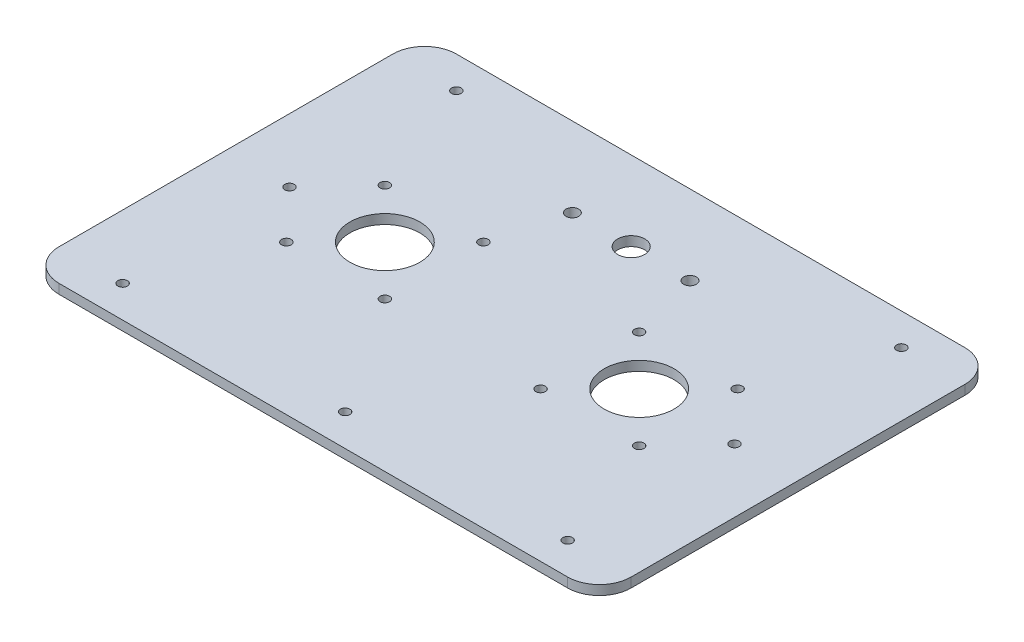
ISO-10303-21;
HEADER;
FILE_DESCRIPTION(('STEP AP214'),'2;1');
FILE_NAME('part.step','',(''),(''),'','','');
FILE_SCHEMA(('AUTOMOTIVE_DESIGN { 1 0 10303 214 1 1 1 1 }'));
ENDSEC;
DATA;
#1=APPLICATION_CONTEXT('core data for automotive mechanical design processes');
#2=APPLICATION_PROTOCOL_DEFINITION('international standard','automotive_design',2000,#1);
#3=PRODUCT_CONTEXT('',#1,'mechanical');
#4=PRODUCT('Part','Part','',(#3));
#5=PRODUCT_RELATED_PRODUCT_CATEGORY('part','',(#4));
#6=PRODUCT_DEFINITION_FORMATION('','',#4);
#7=PRODUCT_DEFINITION_CONTEXT('part definition',#1,'design');
#8=PRODUCT_DEFINITION('design','',#6,#7);
#9=PRODUCT_DEFINITION_SHAPE('','',#8);
#10=(LENGTH_UNIT() NAMED_UNIT(*) SI_UNIT(.MILLI.,.METRE.));
#11=(NAMED_UNIT(*) PLANE_ANGLE_UNIT() SI_UNIT($,.RADIAN.));
#12=(NAMED_UNIT(*) SI_UNIT($,.STERADIAN.) SOLID_ANGLE_UNIT());
#13=UNCERTAINTY_MEASURE_WITH_UNIT(LENGTH_MEASURE(1.E-05),#10,'distance_accuracy_value','');
#14=(GEOMETRIC_REPRESENTATION_CONTEXT(3) GLOBAL_UNCERTAINTY_ASSIGNED_CONTEXT((#13)) GLOBAL_UNIT_ASSIGNED_CONTEXT((#10,
#11,#12)) REPRESENTATION_CONTEXT('',''));
#15=CARTESIAN_POINT('',(0.,0.,0.));
#16=DIRECTION('',(0.,0.,1.));
#17=DIRECTION('',(1.,0.,0.));
#18=AXIS2_PLACEMENT_3D('',#15,#16,#17);
#19=CARTESIAN_POINT('',(-80.,-3.,52.5));
#20=DIRECTION('',(0.,1.,0.));
#21=DIRECTION('',(0.,0.,1.));
#22=AXIS2_PLACEMENT_3D('',#19,#20,#21);
#23=CYLINDRICAL_SURFACE('',#22,9.99999999999998);
#24=CARTESIAN_POINT('',(-80.,0.,52.5));
#25=DIRECTION('',(0.,1.,0.));
#26=DIRECTION('',(0.,0.,1.));
#27=AXIS2_PLACEMENT_3D('',#24,#25,#26);
#28=CIRCLE('',#27,9.99999999999998);
#29=CARTESIAN_POINT('',(-90.,0.,52.5));
#30=VERTEX_POINT('',#29);
#31=CARTESIAN_POINT('',(-79.9999999999999,0.,62.5));
#32=VERTEX_POINT('',#31);
#33=EDGE_CURVE('E134',#30,#32,#28,.T.);
#34=ORIENTED_EDGE('',*,*,#33,.F.);
#35=DIRECTION('',(0.,1.,0.));
#36=VECTOR('',#35,1.);
#37=CARTESIAN_POINT('',(-90.,-3.,52.5));
#38=LINE('',#37,#36);
#39=CARTESIAN_POINT('',(-90.,-3.,52.5));
#40=VERTEX_POINT('',#39);
#41=EDGE_CURVE('E11',#40,#30,#38,.T.);
#42=ORIENTED_EDGE('',*,*,#41,.F.);
#43=CARTESIAN_POINT('',(-80.,-3.,52.5));
#44=DIRECTION('',(0.,1.,0.));
#45=DIRECTION('',(0.,0.,1.));
#46=AXIS2_PLACEMENT_3D('',#43,#44,#45);
#47=CIRCLE('',#46,9.99999999999998);
#48=CARTESIAN_POINT('',(-79.9999999999999,-3.,62.5));
#49=VERTEX_POINT('',#48);
#50=EDGE_CURVE('E155',#40,#49,#47,.T.);
#51=ORIENTED_EDGE('',*,*,#50,.T.);
#52=DIRECTION('',(0.,1.,0.));
#53=VECTOR('',#52,1.);
#54=CARTESIAN_POINT('',(-79.9999999999999,-3.,62.5));
#55=LINE('',#54,#53);
#56=EDGE_CURVE('E40',#49,#32,#55,.T.);
#57=ORIENTED_EDGE('',*,*,#56,.T.);
#58=EDGE_LOOP('',(#34,#42,#51,#57));
#59=FACE_BOUND('',#58,.T.);
#60=ADVANCED_FACE('F37',(#59),#23,.T.);
#61=CARTESIAN_POINT('',(-90.,-3.,-52.5));
#62=DIRECTION('',(-1.,0.,0.));
#63=DIRECTION('',(0.,0.,1.));
#64=AXIS2_PLACEMENT_3D('',#61,#62,#63);
#65=PLANE('',#64);
#66=DIRECTION('',(0.,0.,1.));
#67=VECTOR('',#66,1.);
#68=CARTESIAN_POINT('',(-90.,0.,-52.5));
#69=LINE('',#68,#67);
#70=CARTESIAN_POINT('',(-90.,0.,-52.5));
#71=VERTEX_POINT('',#70);
#72=EDGE_CURVE('E153',#71,#30,#69,.T.);
#73=ORIENTED_EDGE('',*,*,#72,.F.);
#74=DIRECTION('',(0.,1.,0.));
#75=VECTOR('',#74,1.);
#76=CARTESIAN_POINT('',(-90.,-3.,-52.5));
#77=LINE('',#76,#75);
#78=CARTESIAN_POINT('',(-90.,-3.,-52.5));
#79=VERTEX_POINT('',#78);
#80=EDGE_CURVE('E46',#79,#71,#77,.T.);
#81=ORIENTED_EDGE('',*,*,#80,.F.);
#82=DIRECTION('',(0.,0.,1.));
#83=VECTOR('',#82,1.);
#84=CARTESIAN_POINT('',(-90.,-3.,-52.5));
#85=LINE('',#84,#83);
#86=EDGE_CURVE('E124',#79,#40,#85,.T.);
#87=ORIENTED_EDGE('',*,*,#86,.T.);
#88=ORIENTED_EDGE('',*,*,#41,.T.);
#89=EDGE_LOOP('',(#73,#81,#87,#88));
#90=FACE_BOUND('',#89,.T.);
#91=ADVANCED_FACE('F167',(#90),#65,.T.);
#92=CARTESIAN_POINT('',(-80.,-3.,-52.5));
#93=DIRECTION('',(0.,1.,0.));
#94=DIRECTION('',(0.,0.,1.));
#95=AXIS2_PLACEMENT_3D('',#92,#93,#94);
#96=CYLINDRICAL_SURFACE('',#95,10.);
#97=CARTESIAN_POINT('',(-80.,0.,-52.5));
#98=DIRECTION('',(0.,1.,0.));
#99=DIRECTION('',(0.,0.,1.));
#100=AXIS2_PLACEMENT_3D('',#97,#98,#99);
#101=CIRCLE('',#100,10.);
#102=CARTESIAN_POINT('',(-79.9999999999999,0.,-62.5));
#103=VERTEX_POINT('',#102);
#104=EDGE_CURVE('E111',#103,#71,#101,.T.);
#105=ORIENTED_EDGE('',*,*,#104,.F.);
#106=DIRECTION('',(0.,1.,0.));
#107=VECTOR('',#106,1.);
#108=CARTESIAN_POINT('',(-79.9999999999999,-3.,-62.5));
#109=LINE('',#108,#107);
#110=CARTESIAN_POINT('',(-79.9999999999999,-3.,-62.5));
#111=VERTEX_POINT('',#110);
#112=EDGE_CURVE('E106',#111,#103,#109,.T.);
#113=ORIENTED_EDGE('',*,*,#112,.F.);
#114=CARTESIAN_POINT('',(-80.,-3.,-52.5));
#115=DIRECTION('',(0.,1.,0.));
#116=DIRECTION('',(0.,0.,1.));
#117=AXIS2_PLACEMENT_3D('',#114,#115,#116);
#118=CIRCLE('',#117,10.);
#119=EDGE_CURVE('E109',#111,#79,#118,.T.);
#120=ORIENTED_EDGE('',*,*,#119,.T.);
#121=ORIENTED_EDGE('',*,*,#80,.T.);
#122=EDGE_LOOP('',(#105,#113,#120,#121));
#123=FACE_BOUND('',#122,.T.);
#124=ADVANCED_FACE('F108',(#123),#96,.T.);
#125=CARTESIAN_POINT('',(-79.9999999999999,-3.,-62.5));
#126=DIRECTION('',(0.,0.,-1.));
#127=DIRECTION('',(-1.,0.,0.));
#128=AXIS2_PLACEMENT_3D('',#125,#126,#127);
#129=PLANE('',#128);
#130=DIRECTION('',(-1.,0.,0.));
#131=VECTOR('',#130,1.);
#132=CARTESIAN_POINT('',(-79.9999999999999,0.,-62.5));
#133=LINE('',#132,#131);
#134=CARTESIAN_POINT('',(79.9999999999999,0.,-62.5));
#135=VERTEX_POINT('',#134);
#136=EDGE_CURVE('E150',#135,#103,#133,.T.);
#137=ORIENTED_EDGE('',*,*,#136,.F.);
#138=DIRECTION('',(0.,1.,0.));
#139=VECTOR('',#138,1.);
#140=CARTESIAN_POINT('',(79.9999999999999,-3.,-62.5));
#141=LINE('',#140,#139);
#142=CARTESIAN_POINT('',(79.9999999999999,-3.,-62.5));
#143=VERTEX_POINT('',#142);
#144=EDGE_CURVE('E116',#143,#135,#141,.T.);
#145=ORIENTED_EDGE('',*,*,#144,.F.);
#146=DIRECTION('',(-1.,0.,0.));
#147=VECTOR('',#146,1.);
#148=CARTESIAN_POINT('',(-79.9999999999999,-3.,-62.5));
#149=LINE('',#148,#147);
#150=EDGE_CURVE('E122',#143,#111,#149,.T.);
#151=ORIENTED_EDGE('',*,*,#150,.T.);
#152=ORIENTED_EDGE('',*,*,#112,.T.);
#153=EDGE_LOOP('',(#137,#145,#151,#152));
#154=FACE_BOUND('',#153,.T.);
#155=ADVANCED_FACE('F126',(#154),#129,.T.);
#156=CARTESIAN_POINT('',(80.,-3.,-52.5));
#157=DIRECTION('',(0.,1.,0.));
#158=DIRECTION('',(0.,0.,1.));
#159=AXIS2_PLACEMENT_3D('',#156,#157,#158);
#160=CYLINDRICAL_SURFACE('',#159,10.);
#161=CARTESIAN_POINT('',(80.,0.,-52.5));
#162=DIRECTION('',(0.,1.,0.));
#163=DIRECTION('',(0.,0.,1.));
#164=AXIS2_PLACEMENT_3D('',#161,#162,#163);
#165=CIRCLE('',#164,10.);
#166=CARTESIAN_POINT('',(90.,0.,-52.5));
#167=VERTEX_POINT('',#166);
#168=EDGE_CURVE('E147',#167,#135,#165,.T.);
#169=ORIENTED_EDGE('',*,*,#168,.F.);
#170=DIRECTION('',(0.,1.,0.));
#171=VECTOR('',#170,1.);
#172=CARTESIAN_POINT('',(90.,-3.,-52.5));
#173=LINE('',#172,#171);
#174=CARTESIAN_POINT('',(90.,-3.,-52.5));
#175=VERTEX_POINT('',#174);
#176=EDGE_CURVE('E159',#175,#167,#173,.T.);
#177=ORIENTED_EDGE('',*,*,#176,.F.);
#178=CARTESIAN_POINT('',(80.,-3.,-52.5));
#179=DIRECTION('',(0.,1.,0.));
#180=DIRECTION('',(0.,0.,1.));
#181=AXIS2_PLACEMENT_3D('',#178,#179,#180);
#182=CIRCLE('',#181,10.);
#183=EDGE_CURVE('E127',#175,#143,#182,.T.);
#184=ORIENTED_EDGE('',*,*,#183,.T.);
#185=ORIENTED_EDGE('',*,*,#144,.T.);
#186=EDGE_LOOP('',(#169,#177,#184,#185));
#187=FACE_BOUND('',#186,.T.);
#188=ADVANCED_FACE('F180',(#187),#160,.T.);
#189=CARTESIAN_POINT('',(90.,-3.,-52.5));
#190=DIRECTION('',(1.,0.,0.));
#191=DIRECTION('',(0.,0.,-1.));
#192=AXIS2_PLACEMENT_3D('',#189,#190,#191);
#193=PLANE('',#192);
#194=DIRECTION('',(0.,0.,-1.));
#195=VECTOR('',#194,1.);
#196=CARTESIAN_POINT('',(90.,0.,-52.5));
#197=LINE('',#196,#195);
#198=CARTESIAN_POINT('',(90.,0.,52.5));
#199=VERTEX_POINT('',#198);
#200=EDGE_CURVE('E144',#199,#167,#197,.T.);
#201=ORIENTED_EDGE('',*,*,#200,.F.);
#202=DIRECTION('',(0.,1.,0.));
#203=VECTOR('',#202,1.);
#204=CARTESIAN_POINT('',(90.,-3.,52.5));
#205=LINE('',#204,#203);
#206=CARTESIAN_POINT('',(90.,-3.,52.5));
#207=VERTEX_POINT('',#206);
#208=EDGE_CURVE('E161',#207,#199,#205,.T.);
#209=ORIENTED_EDGE('',*,*,#208,.F.);
#210=DIRECTION('',(0.,0.,-1.));
#211=VECTOR('',#210,1.);
#212=CARTESIAN_POINT('',(90.,-3.,-52.5));
#213=LINE('',#212,#211);
#214=EDGE_CURVE('E129',#207,#175,#213,.T.);
#215=ORIENTED_EDGE('',*,*,#214,.T.);
#216=ORIENTED_EDGE('',*,*,#176,.T.);
#217=EDGE_LOOP('',(#201,#209,#215,#216));
#218=FACE_BOUND('',#217,.T.);
#219=ADVANCED_FACE('F183',(#218),#193,.T.);
#220=CARTESIAN_POINT('',(80.,-3.,52.5));
#221=DIRECTION('',(0.,1.,0.));
#222=DIRECTION('',(0.,0.,1.));
#223=AXIS2_PLACEMENT_3D('',#220,#221,#222);
#224=CYLINDRICAL_SURFACE('',#223,9.99999999999999);
#225=CARTESIAN_POINT('',(80.,0.,52.5));
#226=DIRECTION('',(0.,1.,0.));
#227=DIRECTION('',(0.,0.,1.));
#228=AXIS2_PLACEMENT_3D('',#225,#226,#227);
#229=CIRCLE('',#228,9.99999999999999);
#230=CARTESIAN_POINT('',(79.9999999999999,0.,62.5));
#231=VERTEX_POINT('',#230);
#232=EDGE_CURVE('E141',#231,#199,#229,.T.);
#233=ORIENTED_EDGE('',*,*,#232,.F.);
#234=DIRECTION('',(0.,1.,0.));
#235=VECTOR('',#234,1.);
#236=CARTESIAN_POINT('',(79.9999999999999,-3.,62.5));
#237=LINE('',#236,#235);
#238=CARTESIAN_POINT('',(79.9999999999999,-3.,62.5));
#239=VERTEX_POINT('',#238);
#240=EDGE_CURVE('E162',#239,#231,#237,.T.);
#241=ORIENTED_EDGE('',*,*,#240,.F.);
#242=CARTESIAN_POINT('',(80.,-3.,52.5));
#243=DIRECTION('',(0.,1.,0.));
#244=DIRECTION('',(0.,0.,1.));
#245=AXIS2_PLACEMENT_3D('',#242,#243,#244);
#246=CIRCLE('',#245,9.99999999999999);
#247=EDGE_CURVE('E409',#239,#207,#246,.T.);
#248=ORIENTED_EDGE('',*,*,#247,.T.);
#249=ORIENTED_EDGE('',*,*,#208,.T.);
#250=EDGE_LOOP('',(#233,#241,#248,#249));
#251=FACE_BOUND('',#250,.T.);
#252=ADVANCED_FACE('F187',(#251),#224,.T.);
#253=CARTESIAN_POINT('',(-79.9999999999999,-3.,62.5));
#254=DIRECTION('',(0.,0.,1.));
#255=DIRECTION('',(1.,0.,0.));
#256=AXIS2_PLACEMENT_3D('',#253,#254,#255);
#257=PLANE('',#256);
#258=DIRECTION('',(1.,0.,0.));
#259=VECTOR('',#258,1.);
#260=CARTESIAN_POINT('',(-79.9999999999999,0.,62.5));
#261=LINE('',#260,#259);
#262=EDGE_CURVE('E137',#32,#231,#261,.T.);
#263=ORIENTED_EDGE('',*,*,#262,.F.);
#264=ORIENTED_EDGE('',*,*,#56,.F.);
#265=DIRECTION('',(1.,0.,0.));
#266=VECTOR('',#265,1.);
#267=CARTESIAN_POINT('',(-79.9999999999999,-3.,62.5));
#268=LINE('',#267,#266);
#269=EDGE_CURVE('E407',#49,#239,#268,.T.);
#270=ORIENTED_EDGE('',*,*,#269,.T.);
#271=ORIENTED_EDGE('',*,*,#240,.T.);
#272=EDGE_LOOP('',(#263,#264,#270,#271));
#273=FACE_BOUND('',#272,.T.);
#274=ADVANCED_FACE('F164',(#273),#257,.T.);
#275=CARTESIAN_POINT('',(-80.,-3.,52.5));
#276=DIRECTION('',(0.,1.,0.));
#277=DIRECTION('',(0.,0.,1.));
#278=AXIS2_PLACEMENT_3D('',#275,#276,#277);
#279=PLANE('',#278);
#280=CARTESIAN_POINT('',(-55.4999999999996,-3.,-15.4999999999976));
#281=DIRECTION('',(0.,1.,0.));
#282=DIRECTION('',(0.,0.,1.));
#283=AXIS2_PLACEMENT_3D('',#280,#281,#282);
#284=CIRCLE('',#283,1.5);
#285=CARTESIAN_POINT('',(-55.4999999999996,-3.,-13.9999999999976));
#286=VERTEX_POINT('',#285);
#287=EDGE_CURVE('E286',#286,#286,#284,.T.);
#288=ORIENTED_EDGE('',*,*,#287,.T.);
#289=EDGE_LOOP('',(#288));
#290=FACE_BOUND('',#289,.T.);
#291=CARTESIAN_POINT('',(-55.4999999999975,-3.,15.5000000000022));
#292=DIRECTION('',(0.,1.,0.));
#293=DIRECTION('',(0.,0.,1.));
#294=AXIS2_PLACEMENT_3D('',#291,#292,#293);
#295=CIRCLE('',#294,1.50000000000001);
#296=CARTESIAN_POINT('',(-55.4999999999975,-3.,17.0000000000022));
#297=VERTEX_POINT('',#296);
#298=EDGE_CURVE('E294',#297,#297,#295,.T.);
#299=ORIENTED_EDGE('',*,*,#298,.T.);
#300=EDGE_LOOP('',(#299));
#301=FACE_BOUND('',#300,.T.);
#302=CARTESIAN_POINT('',(-24.4999999999977,-3.,15.5000000000001));
#303=DIRECTION('',(0.,1.,0.));
#304=DIRECTION('',(0.,0.,1.));
#305=AXIS2_PLACEMENT_3D('',#302,#303,#304);
#306=CIRCLE('',#305,1.5);
#307=CARTESIAN_POINT('',(-24.4999999999977,-3.,17.0000000000001));
#308=VERTEX_POINT('',#307);
#309=EDGE_CURVE('E300',#308,#308,#306,.T.);
#310=ORIENTED_EDGE('',*,*,#309,.T.);
#311=EDGE_LOOP('',(#310));
#312=FACE_BOUND('',#311,.T.);
#313=CARTESIAN_POINT('',(24.5000000000002,-3.,-15.4999999999997));
#314=DIRECTION('',(0.,1.,0.));
#315=DIRECTION('',(0.,0.,1.));
#316=AXIS2_PLACEMENT_3D('',#313,#314,#315);
#317=CIRCLE('',#316,1.50000000000001);
#318=CARTESIAN_POINT('',(24.5000000000002,-3.,-13.9999999999997));
#319=VERTEX_POINT('',#318);
#320=EDGE_CURVE('E306',#319,#319,#317,.T.);
#321=ORIENTED_EDGE('',*,*,#320,.T.);
#322=EDGE_LOOP('',(#321));
#323=FACE_BOUND('',#322,.T.);
#324=CARTESIAN_POINT('',(24.5000000000003,-3.,15.5000000000003));
#325=DIRECTION('',(0.,1.,0.));
#326=DIRECTION('',(0.,0.,1.));
#327=AXIS2_PLACEMENT_3D('',#324,#325,#326);
#328=CIRCLE('',#327,1.5);
#329=CARTESIAN_POINT('',(24.5000000000003,-3.,17.0000000000003));
#330=VERTEX_POINT('',#329);
#331=EDGE_CURVE('E312',#330,#330,#328,.T.);
#332=ORIENTED_EDGE('',*,*,#331,.T.);
#333=EDGE_LOOP('',(#332));
#334=FACE_BOUND('',#333,.T.);
#335=CARTESIAN_POINT('',(55.5000000000004,-3.,15.5000000000001));
#336=DIRECTION('',(0.,1.,0.));
#337=DIRECTION('',(0.,0.,1.));
#338=AXIS2_PLACEMENT_3D('',#335,#336,#337);
#339=CIRCLE('',#338,1.5);
#340=CARTESIAN_POINT('',(55.5000000000004,-3.,17.0000000000001));
#341=VERTEX_POINT('',#340);
#342=EDGE_CURVE('E318',#341,#341,#339,.T.);
#343=ORIENTED_EDGE('',*,*,#342,.T.);
#344=EDGE_LOOP('',(#343));
#345=FACE_BOUND('',#344,.T.);
#346=CARTESIAN_POINT('',(-24.5,-3.,-15.4999999999997));
#347=DIRECTION('',(0.,1.,0.));
#348=DIRECTION('',(0.,0.,1.));
#349=AXIS2_PLACEMENT_3D('',#346,#347,#348);
#350=CIRCLE('',#349,1.5);
#351=CARTESIAN_POINT('',(-24.5,-3.,-13.9999999999997));
#352=VERTEX_POINT('',#351);
#353=EDGE_CURVE('E324',#352,#352,#350,.T.);
#354=ORIENTED_EDGE('',*,*,#353,.T.);
#355=EDGE_LOOP('',(#354));
#356=FACE_BOUND('',#355,.T.);
#357=CARTESIAN_POINT('',(55.5,-3.,-15.5));
#358=DIRECTION('',(0.,1.,0.));
#359=DIRECTION('',(0.,0.,1.));
#360=AXIS2_PLACEMENT_3D('',#357,#358,#359);
#361=CIRCLE('',#360,1.5);
#362=CARTESIAN_POINT('',(55.5,-3.,-14.));
#363=VERTEX_POINT('',#362);
#364=EDGE_CURVE('E330',#363,#363,#361,.T.);
#365=ORIENTED_EDGE('',*,*,#364,.T.);
#366=EDGE_LOOP('',(#365));
#367=FACE_BOUND('',#366,.T.);
#368=CARTESIAN_POINT('',(-40.,-3.,0.));
#369=DIRECTION('',(0.,1.,0.));
#370=DIRECTION('',(0.,0.,1.));
#371=AXIS2_PLACEMENT_3D('',#368,#369,#370);
#372=CIRCLE('',#371,11.);
#373=CARTESIAN_POINT('',(-40.,-3.,11.));
#374=VERTEX_POINT('',#373);
#375=EDGE_CURVE('E336',#374,#374,#372,.T.);
#376=ORIENTED_EDGE('',*,*,#375,.T.);
#377=EDGE_LOOP('',(#376));
#378=FACE_BOUND('',#377,.T.);
#379=CARTESIAN_POINT('',(40.,-3.,0.));
#380=DIRECTION('',(0.,1.,0.));
#381=DIRECTION('',(0.,0.,1.));
#382=AXIS2_PLACEMENT_3D('',#379,#380,#381);
#383=CIRCLE('',#382,11.);
#384=CARTESIAN_POINT('',(40.,-3.,11.));
#385=VERTEX_POINT('',#384);
#386=EDGE_CURVE('E342',#385,#385,#383,.T.);
#387=ORIENTED_EDGE('',*,*,#386,.T.);
#388=EDGE_LOOP('',(#387));
#389=FACE_BOUND('',#388,.T.);
#390=CARTESIAN_POINT('',(18.5,-3.,-37.5));
#391=DIRECTION('',(0.,1.,0.));
#392=DIRECTION('',(0.,0.,1.));
#393=AXIS2_PLACEMENT_3D('',#390,#391,#392);
#394=CIRCLE('',#393,2.);
#395=CARTESIAN_POINT('',(18.5,-3.,-35.5));
#396=VERTEX_POINT('',#395);
#397=EDGE_CURVE('E348',#396,#396,#394,.T.);
#398=ORIENTED_EDGE('',*,*,#397,.T.);
#399=EDGE_LOOP('',(#398));
#400=FACE_BOUND('',#399,.T.);
#401=CARTESIAN_POINT('',(-18.5,-3.,-37.5));
#402=DIRECTION('',(0.,1.,0.));
#403=DIRECTION('',(0.,0.,1.));
#404=AXIS2_PLACEMENT_3D('',#401,#402,#403);
#405=CIRCLE('',#404,2.);
#406=CARTESIAN_POINT('',(-18.5,-3.,-35.5));
#407=VERTEX_POINT('',#406);
#408=EDGE_CURVE('E354',#407,#407,#405,.T.);
#409=ORIENTED_EDGE('',*,*,#408,.T.);
#410=EDGE_LOOP('',(#409));
#411=FACE_BOUND('',#410,.T.);
#412=CARTESIAN_POINT('',(0.,-3.,-37.5));
#413=DIRECTION('',(0.,1.,0.));
#414=DIRECTION('',(0.,0.,1.));
#415=AXIS2_PLACEMENT_3D('',#412,#413,#414);
#416=CIRCLE('',#415,4.25);
#417=CARTESIAN_POINT('',(0.,-3.,-33.25));
#418=VERTEX_POINT('',#417);
#419=EDGE_CURVE('E360',#418,#418,#416,.T.);
#420=ORIENTED_EDGE('',*,*,#419,.T.);
#421=EDGE_LOOP('',(#420));
#422=FACE_BOUND('',#421,.T.);
#423=CARTESIAN_POINT('',(70.,-3.,-52.5));
#424=DIRECTION('',(0.,1.,0.));
#425=DIRECTION('',(0.,0.,1.));
#426=AXIS2_PLACEMENT_3D('',#423,#424,#425);
#427=CIRCLE('',#426,1.5);
#428=CARTESIAN_POINT('',(70.,-3.,-51.));
#429=VERTEX_POINT('',#428);
#430=EDGE_CURVE('E366',#429,#429,#427,.T.);
#431=ORIENTED_EDGE('',*,*,#430,.T.);
#432=EDGE_LOOP('',(#431));
#433=FACE_BOUND('',#432,.T.);
#434=CARTESIAN_POINT('',(70.,-3.,0.));
#435=DIRECTION('',(0.,1.,0.));
#436=DIRECTION('',(0.,0.,1.));
#437=AXIS2_PLACEMENT_3D('',#434,#435,#436);
#438=CIRCLE('',#437,1.5);
#439=CARTESIAN_POINT('',(70.,-3.,1.5));
#440=VERTEX_POINT('',#439);
#441=EDGE_CURVE('E372',#440,#440,#438,.T.);
#442=ORIENTED_EDGE('',*,*,#441,.T.);
#443=EDGE_LOOP('',(#442));
#444=FACE_BOUND('',#443,.T.);
#445=CARTESIAN_POINT('',(70.,-3.,52.5));
#446=DIRECTION('',(0.,1.,0.));
#447=DIRECTION('',(0.,0.,1.));
#448=AXIS2_PLACEMENT_3D('',#445,#446,#447);
#449=CIRCLE('',#448,1.5);
#450=CARTESIAN_POINT('',(70.,-3.,54.));
#451=VERTEX_POINT('',#450);
#452=EDGE_CURVE('E378',#451,#451,#449,.T.);
#453=ORIENTED_EDGE('',*,*,#452,.T.);
#454=EDGE_LOOP('',(#453));
#455=FACE_BOUND('',#454,.T.);
#456=CARTESIAN_POINT('',(0.,-3.,52.5));
#457=DIRECTION('',(0.,1.,0.));
#458=DIRECTION('',(0.,0.,1.));
#459=AXIS2_PLACEMENT_3D('',#456,#457,#458);
#460=CIRCLE('',#459,1.5);
#461=CARTESIAN_POINT('',(0.,-3.,54.));
#462=VERTEX_POINT('',#461);
#463=EDGE_CURVE('E384',#462,#462,#460,.T.);
#464=ORIENTED_EDGE('',*,*,#463,.T.);
#465=EDGE_LOOP('',(#464));
#466=FACE_BOUND('',#465,.T.);
#467=CARTESIAN_POINT('',(-70.,-3.,52.5));
#468=DIRECTION('',(0.,1.,0.));
#469=DIRECTION('',(0.,0.,1.));
#470=AXIS2_PLACEMENT_3D('',#467,#468,#469);
#471=CIRCLE('',#470,1.5);
#472=CARTESIAN_POINT('',(-70.,-3.,54.));
#473=VERTEX_POINT('',#472);
#474=EDGE_CURVE('E390',#473,#473,#471,.T.);
#475=ORIENTED_EDGE('',*,*,#474,.T.);
#476=EDGE_LOOP('',(#475));
#477=FACE_BOUND('',#476,.T.);
#478=CARTESIAN_POINT('',(-70.,-3.,0.));
#479=DIRECTION('',(0.,1.,0.));
#480=DIRECTION('',(0.,0.,1.));
#481=AXIS2_PLACEMENT_3D('',#478,#479,#480);
#482=CIRCLE('',#481,1.5);
#483=CARTESIAN_POINT('',(-70.,-3.,1.5));
#484=VERTEX_POINT('',#483);
#485=EDGE_CURVE('E396',#484,#484,#482,.T.);
#486=ORIENTED_EDGE('',*,*,#485,.T.);
#487=EDGE_LOOP('',(#486));
#488=FACE_BOUND('',#487,.T.);
#489=CARTESIAN_POINT('',(-70.,-3.,-52.5));
#490=DIRECTION('',(0.,1.,0.));
#491=DIRECTION('',(0.,0.,1.));
#492=AXIS2_PLACEMENT_3D('',#489,#490,#491);
#493=CIRCLE('',#492,1.5);
#494=CARTESIAN_POINT('',(-70.,-3.,-51.));
#495=VERTEX_POINT('',#494);
#496=EDGE_CURVE('E138',#495,#495,#493,.T.);
#497=ORIENTED_EDGE('',*,*,#496,.T.);
#498=EDGE_LOOP('',(#497));
#499=FACE_BOUND('',#498,.T.);
#500=ORIENTED_EDGE('',*,*,#50,.F.);
#501=ORIENTED_EDGE('',*,*,#86,.F.);
#502=ORIENTED_EDGE('',*,*,#119,.F.);
#503=ORIENTED_EDGE('',*,*,#150,.F.);
#504=ORIENTED_EDGE('',*,*,#183,.F.);
#505=ORIENTED_EDGE('',*,*,#214,.F.);
#506=ORIENTED_EDGE('',*,*,#247,.F.);
#507=ORIENTED_EDGE('',*,*,#269,.F.);
#508=EDGE_LOOP('',(#500,#501,#502,#503,#504,#505,#506,#507));
#509=FACE_BOUND('',#508,.T.);
#510=ADVANCED_FACE('F120',(#290,#301,#312,#323,#334,#345,#356,#367,#378,#389,#400,#411,#422,
#433,#444,#455,#466,#477,#488,#499,#509),#279,.F.);
#511=CARTESIAN_POINT('',(-80.,0.,52.5));
#512=DIRECTION('',(0.,1.,0.));
#513=DIRECTION('',(0.,0.,1.));
#514=AXIS2_PLACEMENT_3D('',#511,#512,#513);
#515=PLANE('',#514);
#516=CARTESIAN_POINT('',(-55.4999999999996,0.,-15.4999999999976));
#517=DIRECTION('',(0.,1.,0.));
#518=DIRECTION('',(0.,0.,1.));
#519=AXIS2_PLACEMENT_3D('',#516,#517,#518);
#520=CIRCLE('',#519,1.5);
#521=CARTESIAN_POINT('',(-55.4999999999996,0.,-13.9999999999976));
#522=VERTEX_POINT('',#521);
#523=EDGE_CURVE('E289',#522,#522,#520,.T.);
#524=ORIENTED_EDGE('',*,*,#523,.F.);
#525=EDGE_LOOP('',(#524));
#526=FACE_BOUND('',#525,.T.);
#527=CARTESIAN_POINT('',(-55.4999999999975,0.,15.5000000000022));
#528=DIRECTION('',(0.,1.,0.));
#529=DIRECTION('',(0.,0.,1.));
#530=AXIS2_PLACEMENT_3D('',#527,#528,#529);
#531=CIRCLE('',#530,1.50000000000001);
#532=CARTESIAN_POINT('',(-55.4999999999975,0.,17.0000000000022));
#533=VERTEX_POINT('',#532);
#534=EDGE_CURVE('E291',#533,#533,#531,.T.);
#535=ORIENTED_EDGE('',*,*,#534,.F.);
#536=EDGE_LOOP('',(#535));
#537=FACE_BOUND('',#536,.T.);
#538=CARTESIAN_POINT('',(-24.4999999999977,0.,15.5000000000001));
#539=DIRECTION('',(0.,1.,0.));
#540=DIRECTION('',(0.,0.,1.));
#541=AXIS2_PLACEMENT_3D('',#538,#539,#540);
#542=CIRCLE('',#541,1.5);
#543=CARTESIAN_POINT('',(-24.4999999999977,0.,17.0000000000001));
#544=VERTEX_POINT('',#543);
#545=EDGE_CURVE('E297',#544,#544,#542,.T.);
#546=ORIENTED_EDGE('',*,*,#545,.F.);
#547=EDGE_LOOP('',(#546));
#548=FACE_BOUND('',#547,.T.);
#549=CARTESIAN_POINT('',(24.5000000000002,0.,-15.4999999999997));
#550=DIRECTION('',(0.,1.,0.));
#551=DIRECTION('',(0.,0.,1.));
#552=AXIS2_PLACEMENT_3D('',#549,#550,#551);
#553=CIRCLE('',#552,1.50000000000001);
#554=CARTESIAN_POINT('',(24.5000000000002,0.,-13.9999999999997));
#555=VERTEX_POINT('',#554);
#556=EDGE_CURVE('E303',#555,#555,#553,.T.);
#557=ORIENTED_EDGE('',*,*,#556,.F.);
#558=EDGE_LOOP('',(#557));
#559=FACE_BOUND('',#558,.T.);
#560=CARTESIAN_POINT('',(24.5000000000003,0.,15.5000000000003));
#561=DIRECTION('',(0.,1.,0.));
#562=DIRECTION('',(0.,0.,1.));
#563=AXIS2_PLACEMENT_3D('',#560,#561,#562);
#564=CIRCLE('',#563,1.5);
#565=CARTESIAN_POINT('',(24.5000000000003,0.,17.0000000000003));
#566=VERTEX_POINT('',#565);
#567=EDGE_CURVE('E309',#566,#566,#564,.T.);
#568=ORIENTED_EDGE('',*,*,#567,.F.);
#569=EDGE_LOOP('',(#568));
#570=FACE_BOUND('',#569,.T.);
#571=CARTESIAN_POINT('',(55.5000000000004,0.,15.5000000000001));
#572=DIRECTION('',(0.,1.,0.));
#573=DIRECTION('',(0.,0.,1.));
#574=AXIS2_PLACEMENT_3D('',#571,#572,#573);
#575=CIRCLE('',#574,1.5);
#576=CARTESIAN_POINT('',(55.5000000000004,0.,17.0000000000001));
#577=VERTEX_POINT('',#576);
#578=EDGE_CURVE('E315',#577,#577,#575,.T.);
#579=ORIENTED_EDGE('',*,*,#578,.F.);
#580=EDGE_LOOP('',(#579));
#581=FACE_BOUND('',#580,.T.);
#582=CARTESIAN_POINT('',(-24.5,0.,-15.4999999999997));
#583=DIRECTION('',(0.,1.,0.));
#584=DIRECTION('',(0.,0.,1.));
#585=AXIS2_PLACEMENT_3D('',#582,#583,#584);
#586=CIRCLE('',#585,1.5);
#587=CARTESIAN_POINT('',(-24.5,0.,-13.9999999999997));
#588=VERTEX_POINT('',#587);
#589=EDGE_CURVE('E321',#588,#588,#586,.T.);
#590=ORIENTED_EDGE('',*,*,#589,.F.);
#591=EDGE_LOOP('',(#590));
#592=FACE_BOUND('',#591,.T.);
#593=CARTESIAN_POINT('',(55.5,0.,-15.5));
#594=DIRECTION('',(0.,1.,0.));
#595=DIRECTION('',(0.,0.,1.));
#596=AXIS2_PLACEMENT_3D('',#593,#594,#595);
#597=CIRCLE('',#596,1.5);
#598=CARTESIAN_POINT('',(55.5,0.,-14.));
#599=VERTEX_POINT('',#598);
#600=EDGE_CURVE('E327',#599,#599,#597,.T.);
#601=ORIENTED_EDGE('',*,*,#600,.F.);
#602=EDGE_LOOP('',(#601));
#603=FACE_BOUND('',#602,.T.);
#604=CARTESIAN_POINT('',(-40.,0.,0.));
#605=DIRECTION('',(0.,1.,0.));
#606=DIRECTION('',(0.,0.,1.));
#607=AXIS2_PLACEMENT_3D('',#604,#605,#606);
#608=CIRCLE('',#607,11.);
#609=CARTESIAN_POINT('',(-40.,0.,11.));
#610=VERTEX_POINT('',#609);
#611=EDGE_CURVE('E333',#610,#610,#608,.T.);
#612=ORIENTED_EDGE('',*,*,#611,.F.);
#613=EDGE_LOOP('',(#612));
#614=FACE_BOUND('',#613,.T.);
#615=CARTESIAN_POINT('',(40.,0.,0.));
#616=DIRECTION('',(0.,1.,0.));
#617=DIRECTION('',(0.,0.,1.));
#618=AXIS2_PLACEMENT_3D('',#615,#616,#617);
#619=CIRCLE('',#618,11.);
#620=CARTESIAN_POINT('',(40.,0.,11.));
#621=VERTEX_POINT('',#620);
#622=EDGE_CURVE('E339',#621,#621,#619,.T.);
#623=ORIENTED_EDGE('',*,*,#622,.F.);
#624=EDGE_LOOP('',(#623));
#625=FACE_BOUND('',#624,.T.);
#626=CARTESIAN_POINT('',(18.5,0.,-37.5));
#627=DIRECTION('',(0.,1.,0.));
#628=DIRECTION('',(0.,0.,1.));
#629=AXIS2_PLACEMENT_3D('',#626,#627,#628);
#630=CIRCLE('',#629,2.);
#631=CARTESIAN_POINT('',(18.5,0.,-35.5));
#632=VERTEX_POINT('',#631);
#633=EDGE_CURVE('E345',#632,#632,#630,.T.);
#634=ORIENTED_EDGE('',*,*,#633,.F.);
#635=EDGE_LOOP('',(#634));
#636=FACE_BOUND('',#635,.T.);
#637=CARTESIAN_POINT('',(-18.5,0.,-37.5));
#638=DIRECTION('',(0.,1.,0.));
#639=DIRECTION('',(0.,0.,1.));
#640=AXIS2_PLACEMENT_3D('',#637,#638,#639);
#641=CIRCLE('',#640,2.);
#642=CARTESIAN_POINT('',(-18.5,0.,-35.5));
#643=VERTEX_POINT('',#642);
#644=EDGE_CURVE('E351',#643,#643,#641,.T.);
#645=ORIENTED_EDGE('',*,*,#644,.F.);
#646=EDGE_LOOP('',(#645));
#647=FACE_BOUND('',#646,.T.);
#648=CARTESIAN_POINT('',(0.,0.,-37.5));
#649=DIRECTION('',(0.,1.,0.));
#650=DIRECTION('',(0.,0.,1.));
#651=AXIS2_PLACEMENT_3D('',#648,#649,#650);
#652=CIRCLE('',#651,4.25);
#653=CARTESIAN_POINT('',(0.,0.,-33.25));
#654=VERTEX_POINT('',#653);
#655=EDGE_CURVE('E357',#654,#654,#652,.T.);
#656=ORIENTED_EDGE('',*,*,#655,.F.);
#657=EDGE_LOOP('',(#656));
#658=FACE_BOUND('',#657,.T.);
#659=CARTESIAN_POINT('',(70.,0.,-52.5));
#660=DIRECTION('',(0.,1.,0.));
#661=DIRECTION('',(0.,0.,1.));
#662=AXIS2_PLACEMENT_3D('',#659,#660,#661);
#663=CIRCLE('',#662,1.5);
#664=CARTESIAN_POINT('',(70.,0.,-51.));
#665=VERTEX_POINT('',#664);
#666=EDGE_CURVE('E363',#665,#665,#663,.T.);
#667=ORIENTED_EDGE('',*,*,#666,.F.);
#668=EDGE_LOOP('',(#667));
#669=FACE_BOUND('',#668,.T.);
#670=CARTESIAN_POINT('',(70.,0.,0.));
#671=DIRECTION('',(0.,1.,0.));
#672=DIRECTION('',(0.,0.,1.));
#673=AXIS2_PLACEMENT_3D('',#670,#671,#672);
#674=CIRCLE('',#673,1.5);
#675=CARTESIAN_POINT('',(70.,0.,1.5));
#676=VERTEX_POINT('',#675);
#677=EDGE_CURVE('E369',#676,#676,#674,.T.);
#678=ORIENTED_EDGE('',*,*,#677,.F.);
#679=EDGE_LOOP('',(#678));
#680=FACE_BOUND('',#679,.T.);
#681=CARTESIAN_POINT('',(70.,0.,52.5));
#682=DIRECTION('',(0.,1.,0.));
#683=DIRECTION('',(0.,0.,1.));
#684=AXIS2_PLACEMENT_3D('',#681,#682,#683);
#685=CIRCLE('',#684,1.5);
#686=CARTESIAN_POINT('',(70.,0.,54.));
#687=VERTEX_POINT('',#686);
#688=EDGE_CURVE('E375',#687,#687,#685,.T.);
#689=ORIENTED_EDGE('',*,*,#688,.F.);
#690=EDGE_LOOP('',(#689));
#691=FACE_BOUND('',#690,.T.);
#692=CARTESIAN_POINT('',(0.,0.,52.5));
#693=DIRECTION('',(0.,1.,0.));
#694=DIRECTION('',(0.,0.,1.));
#695=AXIS2_PLACEMENT_3D('',#692,#693,#694);
#696=CIRCLE('',#695,1.5);
#697=CARTESIAN_POINT('',(0.,0.,54.));
#698=VERTEX_POINT('',#697);
#699=EDGE_CURVE('E381',#698,#698,#696,.T.);
#700=ORIENTED_EDGE('',*,*,#699,.F.);
#701=EDGE_LOOP('',(#700));
#702=FACE_BOUND('',#701,.T.);
#703=CARTESIAN_POINT('',(-70.,0.,52.5));
#704=DIRECTION('',(0.,1.,0.));
#705=DIRECTION('',(0.,0.,1.));
#706=AXIS2_PLACEMENT_3D('',#703,#704,#705);
#707=CIRCLE('',#706,1.5);
#708=CARTESIAN_POINT('',(-70.,0.,54.));
#709=VERTEX_POINT('',#708);
#710=EDGE_CURVE('E387',#709,#709,#707,.T.);
#711=ORIENTED_EDGE('',*,*,#710,.F.);
#712=EDGE_LOOP('',(#711));
#713=FACE_BOUND('',#712,.T.);
#714=CARTESIAN_POINT('',(-70.,0.,0.));
#715=DIRECTION('',(0.,1.,0.));
#716=DIRECTION('',(0.,0.,1.));
#717=AXIS2_PLACEMENT_3D('',#714,#715,#716);
#718=CIRCLE('',#717,1.5);
#719=CARTESIAN_POINT('',(-70.,0.,1.5));
#720=VERTEX_POINT('',#719);
#721=EDGE_CURVE('E393',#720,#720,#718,.T.);
#722=ORIENTED_EDGE('',*,*,#721,.F.);
#723=EDGE_LOOP('',(#722));
#724=FACE_BOUND('',#723,.T.);
#725=CARTESIAN_POINT('',(-70.,0.,-52.5));
#726=DIRECTION('',(0.,1.,0.));
#727=DIRECTION('',(0.,0.,1.));
#728=AXIS2_PLACEMENT_3D('',#725,#726,#727);
#729=CIRCLE('',#728,1.5);
#730=CARTESIAN_POINT('',(-70.,0.,-51.));
#731=VERTEX_POINT('',#730);
#732=EDGE_CURVE('E399',#731,#731,#729,.T.);
#733=ORIENTED_EDGE('',*,*,#732,.F.);
#734=EDGE_LOOP('',(#733));
#735=FACE_BOUND('',#734,.T.);
#736=ORIENTED_EDGE('',*,*,#33,.T.);
#737=ORIENTED_EDGE('',*,*,#262,.T.);
#738=ORIENTED_EDGE('',*,*,#232,.T.);
#739=ORIENTED_EDGE('',*,*,#200,.T.);
#740=ORIENTED_EDGE('',*,*,#168,.T.);
#741=ORIENTED_EDGE('',*,*,#136,.T.);
#742=ORIENTED_EDGE('',*,*,#104,.T.);
#743=ORIENTED_EDGE('',*,*,#72,.T.);
#744=EDGE_LOOP('',(#736,#737,#738,#739,#740,#741,#742,#743));
#745=FACE_BOUND('',#744,.T.);
#746=ADVANCED_FACE('F166',(#526,#537,#548,#559,#570,#581,#592,#603,#614,#625,#636,#647,#658,
#669,#680,#691,#702,#713,#724,#735,#745),#515,.T.);
#747=CARTESIAN_POINT('',(-70.,-3.,-52.5));
#748=DIRECTION('',(0.,1.,0.));
#749=DIRECTION('',(0.,0.,1.));
#750=AXIS2_PLACEMENT_3D('',#747,#748,#749);
#751=CYLINDRICAL_SURFACE('',#750,1.5);
#752=ORIENTED_EDGE('',*,*,#496,.F.);
#753=EDGE_LOOP('',(#752));
#754=FACE_BOUND('',#753,.T.);
#755=ORIENTED_EDGE('',*,*,#732,.T.);
#756=EDGE_LOOP('',(#755));
#757=FACE_BOUND('',#756,.T.);
#758=ADVANCED_FACE('F199',(#754,#757),#751,.F.);
#759=CARTESIAN_POINT('',(-70.,-3.,0.));
#760=DIRECTION('',(0.,1.,0.));
#761=DIRECTION('',(0.,0.,1.));
#762=AXIS2_PLACEMENT_3D('',#759,#760,#761);
#763=CYLINDRICAL_SURFACE('',#762,1.5);
#764=ORIENTED_EDGE('',*,*,#485,.F.);
#765=EDGE_LOOP('',(#764));
#766=FACE_BOUND('',#765,.T.);
#767=ORIENTED_EDGE('',*,*,#721,.T.);
#768=EDGE_LOOP('',(#767));
#769=FACE_BOUND('',#768,.T.);
#770=ADVANCED_FACE('F206',(#766,#769),#763,.F.);
#771=CARTESIAN_POINT('',(-70.,-3.,52.5));
#772=DIRECTION('',(0.,1.,0.));
#773=DIRECTION('',(0.,0.,1.));
#774=AXIS2_PLACEMENT_3D('',#771,#772,#773);
#775=CYLINDRICAL_SURFACE('',#774,1.5);
#776=ORIENTED_EDGE('',*,*,#474,.F.);
#777=EDGE_LOOP('',(#776));
#778=FACE_BOUND('',#777,.T.);
#779=ORIENTED_EDGE('',*,*,#710,.T.);
#780=EDGE_LOOP('',(#779));
#781=FACE_BOUND('',#780,.T.);
#782=ADVANCED_FACE('F210',(#778,#781),#775,.F.);
#783=CARTESIAN_POINT('',(0.,-3.,52.5));
#784=DIRECTION('',(0.,1.,0.));
#785=DIRECTION('',(0.,0.,1.));
#786=AXIS2_PLACEMENT_3D('',#783,#784,#785);
#787=CYLINDRICAL_SURFACE('',#786,1.5);
#788=ORIENTED_EDGE('',*,*,#463,.F.);
#789=EDGE_LOOP('',(#788));
#790=FACE_BOUND('',#789,.T.);
#791=ORIENTED_EDGE('',*,*,#699,.T.);
#792=EDGE_LOOP('',(#791));
#793=FACE_BOUND('',#792,.T.);
#794=ADVANCED_FACE('F214',(#790,#793),#787,.F.);
#795=CARTESIAN_POINT('',(70.,-3.,52.5));
#796=DIRECTION('',(0.,1.,0.));
#797=DIRECTION('',(0.,0.,1.));
#798=AXIS2_PLACEMENT_3D('',#795,#796,#797);
#799=CYLINDRICAL_SURFACE('',#798,1.5);
#800=ORIENTED_EDGE('',*,*,#452,.F.);
#801=EDGE_LOOP('',(#800));
#802=FACE_BOUND('',#801,.T.);
#803=ORIENTED_EDGE('',*,*,#688,.T.);
#804=EDGE_LOOP('',(#803));
#805=FACE_BOUND('',#804,.T.);
#806=ADVANCED_FACE('F218',(#802,#805),#799,.F.);
#807=CARTESIAN_POINT('',(70.,-3.,0.));
#808=DIRECTION('',(0.,1.,0.));
#809=DIRECTION('',(0.,0.,1.));
#810=AXIS2_PLACEMENT_3D('',#807,#808,#809);
#811=CYLINDRICAL_SURFACE('',#810,1.5);
#812=ORIENTED_EDGE('',*,*,#441,.F.);
#813=EDGE_LOOP('',(#812));
#814=FACE_BOUND('',#813,.T.);
#815=ORIENTED_EDGE('',*,*,#677,.T.);
#816=EDGE_LOOP('',(#815));
#817=FACE_BOUND('',#816,.T.);
#818=ADVANCED_FACE('F222',(#814,#817),#811,.F.);
#819=CARTESIAN_POINT('',(70.,-3.,-52.5));
#820=DIRECTION('',(0.,1.,0.));
#821=DIRECTION('',(0.,0.,1.));
#822=AXIS2_PLACEMENT_3D('',#819,#820,#821);
#823=CYLINDRICAL_SURFACE('',#822,1.5);
#824=ORIENTED_EDGE('',*,*,#430,.F.);
#825=EDGE_LOOP('',(#824));
#826=FACE_BOUND('',#825,.T.);
#827=ORIENTED_EDGE('',*,*,#666,.T.);
#828=EDGE_LOOP('',(#827));
#829=FACE_BOUND('',#828,.T.);
#830=ADVANCED_FACE('F226',(#826,#829),#823,.F.);
#831=CARTESIAN_POINT('',(0.,-3.,-37.5));
#832=DIRECTION('',(0.,1.,0.));
#833=DIRECTION('',(0.,0.,1.));
#834=AXIS2_PLACEMENT_3D('',#831,#832,#833);
#835=CYLINDRICAL_SURFACE('',#834,4.25);
#836=ORIENTED_EDGE('',*,*,#419,.F.);
#837=EDGE_LOOP('',(#836));
#838=FACE_BOUND('',#837,.T.);
#839=ORIENTED_EDGE('',*,*,#655,.T.);
#840=EDGE_LOOP('',(#839));
#841=FACE_BOUND('',#840,.T.);
#842=ADVANCED_FACE('F230',(#838,#841),#835,.F.);
#843=CARTESIAN_POINT('',(-18.5,-3.,-37.5));
#844=DIRECTION('',(0.,1.,0.));
#845=DIRECTION('',(0.,0.,1.));
#846=AXIS2_PLACEMENT_3D('',#843,#844,#845);
#847=CYLINDRICAL_SURFACE('',#846,2.);
#848=ORIENTED_EDGE('',*,*,#408,.F.);
#849=EDGE_LOOP('',(#848));
#850=FACE_BOUND('',#849,.T.);
#851=ORIENTED_EDGE('',*,*,#644,.T.);
#852=EDGE_LOOP('',(#851));
#853=FACE_BOUND('',#852,.T.);
#854=ADVANCED_FACE('F234',(#850,#853),#847,.F.);
#855=CARTESIAN_POINT('',(18.5,-3.,-37.5));
#856=DIRECTION('',(0.,1.,0.));
#857=DIRECTION('',(0.,0.,1.));
#858=AXIS2_PLACEMENT_3D('',#855,#856,#857);
#859=CYLINDRICAL_SURFACE('',#858,2.);
#860=ORIENTED_EDGE('',*,*,#397,.F.);
#861=EDGE_LOOP('',(#860));
#862=FACE_BOUND('',#861,.T.);
#863=ORIENTED_EDGE('',*,*,#633,.T.);
#864=EDGE_LOOP('',(#863));
#865=FACE_BOUND('',#864,.T.);
#866=ADVANCED_FACE('F238',(#862,#865),#859,.F.);
#867=CARTESIAN_POINT('',(40.,-3.,0.));
#868=DIRECTION('',(0.,1.,0.));
#869=DIRECTION('',(0.,0.,1.));
#870=AXIS2_PLACEMENT_3D('',#867,#868,#869);
#871=CYLINDRICAL_SURFACE('',#870,11.);
#872=ORIENTED_EDGE('',*,*,#386,.F.);
#873=EDGE_LOOP('',(#872));
#874=FACE_BOUND('',#873,.T.);
#875=ORIENTED_EDGE('',*,*,#622,.T.);
#876=EDGE_LOOP('',(#875));
#877=FACE_BOUND('',#876,.T.);
#878=ADVANCED_FACE('F242',(#874,#877),#871,.F.);
#879=CARTESIAN_POINT('',(-40.,-3.,0.));
#880=DIRECTION('',(0.,1.,0.));
#881=DIRECTION('',(0.,0.,1.));
#882=AXIS2_PLACEMENT_3D('',#879,#880,#881);
#883=CYLINDRICAL_SURFACE('',#882,11.);
#884=ORIENTED_EDGE('',*,*,#375,.F.);
#885=EDGE_LOOP('',(#884));
#886=FACE_BOUND('',#885,.T.);
#887=ORIENTED_EDGE('',*,*,#611,.T.);
#888=EDGE_LOOP('',(#887));
#889=FACE_BOUND('',#888,.T.);
#890=ADVANCED_FACE('F246',(#886,#889),#883,.F.);
#891=CARTESIAN_POINT('',(55.5,-3.,-15.5));
#892=DIRECTION('',(0.,1.,0.));
#893=DIRECTION('',(0.,0.,1.));
#894=AXIS2_PLACEMENT_3D('',#891,#892,#893);
#895=CYLINDRICAL_SURFACE('',#894,1.5);
#896=ORIENTED_EDGE('',*,*,#364,.F.);
#897=EDGE_LOOP('',(#896));
#898=FACE_BOUND('',#897,.T.);
#899=ORIENTED_EDGE('',*,*,#600,.T.);
#900=EDGE_LOOP('',(#899));
#901=FACE_BOUND('',#900,.T.);
#902=ADVANCED_FACE('F250',(#898,#901),#895,.F.);
#903=CARTESIAN_POINT('',(-24.5,-3.,-15.4999999999997));
#904=DIRECTION('',(0.,1.,0.));
#905=DIRECTION('',(0.,0.,1.));
#906=AXIS2_PLACEMENT_3D('',#903,#904,#905);
#907=CYLINDRICAL_SURFACE('',#906,1.5);
#908=ORIENTED_EDGE('',*,*,#353,.F.);
#909=EDGE_LOOP('',(#908));
#910=FACE_BOUND('',#909,.T.);
#911=ORIENTED_EDGE('',*,*,#589,.T.);
#912=EDGE_LOOP('',(#911));
#913=FACE_BOUND('',#912,.T.);
#914=ADVANCED_FACE('F254',(#910,#913),#907,.F.);
#915=CARTESIAN_POINT('',(55.5000000000004,-3.,15.5000000000001));
#916=DIRECTION('',(0.,1.,0.));
#917=DIRECTION('',(0.,0.,1.));
#918=AXIS2_PLACEMENT_3D('',#915,#916,#917);
#919=CYLINDRICAL_SURFACE('',#918,1.5);
#920=ORIENTED_EDGE('',*,*,#342,.F.);
#921=EDGE_LOOP('',(#920));
#922=FACE_BOUND('',#921,.T.);
#923=ORIENTED_EDGE('',*,*,#578,.T.);
#924=EDGE_LOOP('',(#923));
#925=FACE_BOUND('',#924,.T.);
#926=ADVANCED_FACE('F258',(#922,#925),#919,.F.);
#927=CARTESIAN_POINT('',(24.5000000000003,-3.,15.5000000000003));
#928=DIRECTION('',(0.,1.,0.));
#929=DIRECTION('',(0.,0.,1.));
#930=AXIS2_PLACEMENT_3D('',#927,#928,#929);
#931=CYLINDRICAL_SURFACE('',#930,1.5);
#932=ORIENTED_EDGE('',*,*,#331,.F.);
#933=EDGE_LOOP('',(#932));
#934=FACE_BOUND('',#933,.T.);
#935=ORIENTED_EDGE('',*,*,#567,.T.);
#936=EDGE_LOOP('',(#935));
#937=FACE_BOUND('',#936,.T.);
#938=ADVANCED_FACE('F262',(#934,#937),#931,.F.);
#939=CARTESIAN_POINT('',(24.5000000000002,-3.,-15.4999999999997));
#940=DIRECTION('',(0.,1.,0.));
#941=DIRECTION('',(0.,0.,1.));
#942=AXIS2_PLACEMENT_3D('',#939,#940,#941);
#943=CYLINDRICAL_SURFACE('',#942,1.50000000000001);
#944=ORIENTED_EDGE('',*,*,#320,.F.);
#945=EDGE_LOOP('',(#944));
#946=FACE_BOUND('',#945,.T.);
#947=ORIENTED_EDGE('',*,*,#556,.T.);
#948=EDGE_LOOP('',(#947));
#949=FACE_BOUND('',#948,.T.);
#950=ADVANCED_FACE('F266',(#946,#949),#943,.F.);
#951=CARTESIAN_POINT('',(-24.4999999999977,-3.,15.5000000000001));
#952=DIRECTION('',(0.,1.,0.));
#953=DIRECTION('',(0.,0.,1.));
#954=AXIS2_PLACEMENT_3D('',#951,#952,#953);
#955=CYLINDRICAL_SURFACE('',#954,1.5);
#956=ORIENTED_EDGE('',*,*,#309,.F.);
#957=EDGE_LOOP('',(#956));
#958=FACE_BOUND('',#957,.T.);
#959=ORIENTED_EDGE('',*,*,#545,.T.);
#960=EDGE_LOOP('',(#959));
#961=FACE_BOUND('',#960,.T.);
#962=ADVANCED_FACE('F270',(#958,#961),#955,.F.);
#963=CARTESIAN_POINT('',(-55.4999999999975,-3.,15.5000000000022));
#964=DIRECTION('',(0.,1.,0.));
#965=DIRECTION('',(0.,0.,1.));
#966=AXIS2_PLACEMENT_3D('',#963,#964,#965);
#967=CYLINDRICAL_SURFACE('',#966,1.50000000000001);
#968=ORIENTED_EDGE('',*,*,#298,.F.);
#969=EDGE_LOOP('',(#968));
#970=FACE_BOUND('',#969,.T.);
#971=ORIENTED_EDGE('',*,*,#534,.T.);
#972=EDGE_LOOP('',(#971));
#973=FACE_BOUND('',#972,.T.);
#974=ADVANCED_FACE('F274',(#970,#973),#967,.F.);
#975=CARTESIAN_POINT('',(-55.4999999999996,-3.,-15.4999999999976));
#976=DIRECTION('',(0.,1.,0.));
#977=DIRECTION('',(0.,0.,1.));
#978=AXIS2_PLACEMENT_3D('',#975,#976,#977);
#979=CYLINDRICAL_SURFACE('',#978,1.5);
#980=ORIENTED_EDGE('',*,*,#287,.F.);
#981=EDGE_LOOP('',(#980));
#982=FACE_BOUND('',#981,.T.);
#983=ORIENTED_EDGE('',*,*,#523,.T.);
#984=EDGE_LOOP('',(#983));
#985=FACE_BOUND('',#984,.T.);
#986=ADVANCED_FACE('F278',(#982,#985),#979,.F.);
#987=CLOSED_SHELL('',(#60,#91,#124,#155,#188,#219,#252,#274,#510,#746,#758,#770,#782,#794,#806,
#818,#830,#842,#854,#866,#878,#890,#902,#914,#926,#938,#950,#962,#974,#986));
#988=MANIFOLD_SOLID_BREP('B2',#987);
#989=ADVANCED_BREP_SHAPE_REPRESENTATION('',(#18,#988),#14);
#990=SHAPE_DEFINITION_REPRESENTATION(#9,#989);
ENDSEC;
END-ISO-10303-21;
